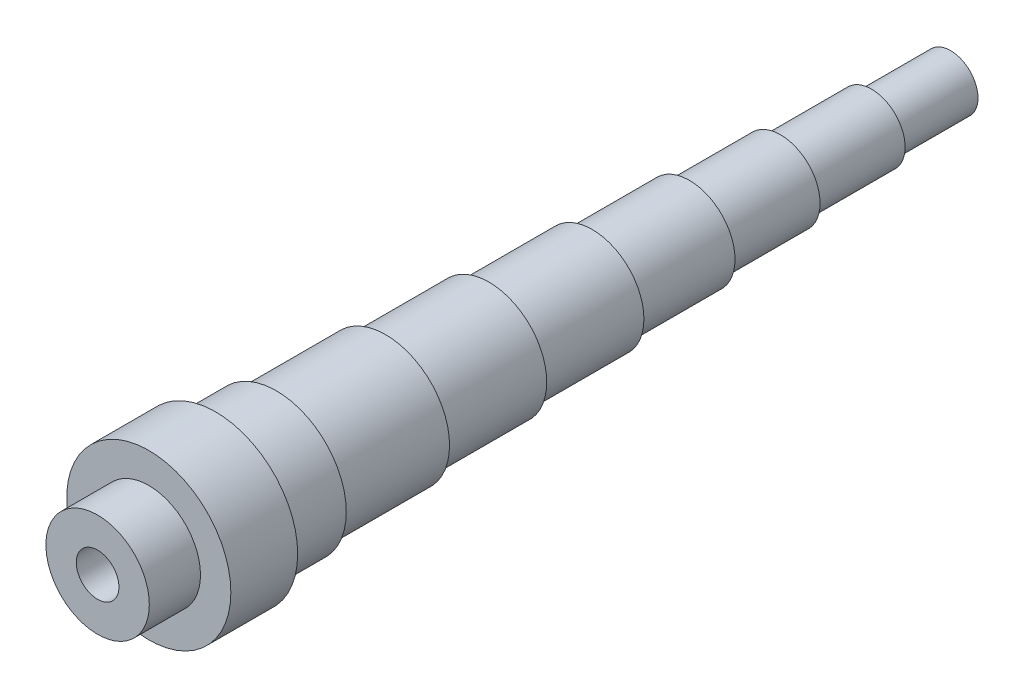
ISO-10303-21;
HEADER;
FILE_DESCRIPTION(('STEP AP214'),'2;1');
FILE_NAME('part.step','',(''),(''),'','','');
FILE_SCHEMA(('AUTOMOTIVE_DESIGN { 1 0 10303 214 1 1 1 1 }'));
ENDSEC;
DATA;
#1=APPLICATION_CONTEXT('core data for automotive mechanical design processes');
#2=APPLICATION_PROTOCOL_DEFINITION('international standard','automotive_design',2000,#1);
#3=PRODUCT_CONTEXT('',#1,'mechanical');
#4=PRODUCT('Part','Part','',(#3));
#5=PRODUCT_RELATED_PRODUCT_CATEGORY('part','',(#4));
#6=PRODUCT_DEFINITION_FORMATION('','',#4);
#7=PRODUCT_DEFINITION_CONTEXT('part definition',#1,'design');
#8=PRODUCT_DEFINITION('design','',#6,#7);
#9=PRODUCT_DEFINITION_SHAPE('','',#8);
#10=(LENGTH_UNIT() NAMED_UNIT(*) SI_UNIT(.MILLI.,.METRE.));
#11=(NAMED_UNIT(*) PLANE_ANGLE_UNIT() SI_UNIT($,.RADIAN.));
#12=(NAMED_UNIT(*) SI_UNIT($,.STERADIAN.) SOLID_ANGLE_UNIT());
#13=UNCERTAINTY_MEASURE_WITH_UNIT(LENGTH_MEASURE(1.E-05),#10,'distance_accuracy_value','');
#14=(GEOMETRIC_REPRESENTATION_CONTEXT(3) GLOBAL_UNCERTAINTY_ASSIGNED_CONTEXT((#13)) GLOBAL_UNIT_ASSIGNED_CONTEXT((#10,
#11,#12)) REPRESENTATION_CONTEXT('',''));
#15=CARTESIAN_POINT('',(0.,0.,0.));
#16=DIRECTION('',(0.,0.,1.));
#17=DIRECTION('',(1.,0.,0.));
#18=AXIS2_PLACEMENT_3D('',#15,#16,#17);
#19=CARTESIAN_POINT('',(0.,0.,19.9049289186182));
#20=DIRECTION('',(0.,0.,1.));
#21=DIRECTION('',(1.,0.,0.));
#22=AXIS2_PLACEMENT_3D('',#19,#20,#21);
#23=CYLINDRICAL_SURFACE('',#22,12.7);
#24=CARTESIAN_POINT('',(0.,0.,-213.40064));
#25=DIRECTION('',(0.,0.,1.));
#26=DIRECTION('',(1.,0.,0.));
#27=AXIS2_PLACEMENT_3D('',#24,#25,#26);
#28=CIRCLE('',#27,12.7);
#29=CARTESIAN_POINT('',(12.7,0.,-213.40064));
#30=VERTEX_POINT('',#29);
#31=EDGE_CURVE('E10',#30,#30,#28,.T.);
#32=ORIENTED_EDGE('',*,*,#31,.F.);
#33=EDGE_LOOP('',(#32));
#34=FACE_BOUND('',#33,.T.);
#35=CARTESIAN_POINT('',(0.,0.,294.51808));
#36=DIRECTION('',(0.,0.,1.));
#37=DIRECTION('',(1.,0.,0.));
#38=AXIS2_PLACEMENT_3D('',#35,#36,#37);
#39=CIRCLE('',#38,12.7);
#40=CARTESIAN_POINT('',(12.7,0.,294.51808));
#41=VERTEX_POINT('',#40);
#42=EDGE_CURVE('E101',#41,#41,#39,.T.);
#43=ORIENTED_EDGE('',*,*,#42,.T.);
#44=EDGE_LOOP('',(#43));
#45=FACE_BOUND('',#44,.T.);
#46=ADVANCED_FACE('F31',(#34,#45),#23,.F.);
#47=CARTESIAN_POINT('',(0.,12.7,-213.40064));
#48=DIRECTION('',(0.,0.,1.));
#49=DIRECTION('',(1.,0.,0.));
#50=AXIS2_PLACEMENT_3D('',#47,#48,#49);
#51=PLANE('',#50);
#52=CARTESIAN_POINT('',(0.,0.,-213.40064));
#53=DIRECTION('',(0.,0.,1.));
#54=DIRECTION('',(1.,0.,0.));
#55=AXIS2_PLACEMENT_3D('',#52,#53,#54);
#56=CIRCLE('',#55,16.31696);
#57=CARTESIAN_POINT('',(16.31696,0.,-213.40064));
#58=VERTEX_POINT('',#57);
#59=EDGE_CURVE('E37',#58,#58,#56,.T.);
#60=ORIENTED_EDGE('',*,*,#59,.F.);
#61=EDGE_LOOP('',(#60));
#62=FACE_BOUND('',#61,.T.);
#63=ORIENTED_EDGE('',*,*,#31,.T.);
#64=EDGE_LOOP('',(#63));
#65=FACE_BOUND('',#64,.T.);
#66=ADVANCED_FACE('F222',(#62,#65),#51,.F.);
#67=CARTESIAN_POINT('',(0.,0.,19.9049289186182));
#68=DIRECTION('',(0.,0.,1.));
#69=DIRECTION('',(1.,0.,0.));
#70=AXIS2_PLACEMENT_3D('',#67,#68,#69);
#71=CYLINDRICAL_SURFACE('',#70,16.31696);
#72=CARTESIAN_POINT('',(0.,0.,-166.38016));
#73=DIRECTION('',(0.,0.,1.));
#74=DIRECTION('',(1.,0.,0.));
#75=AXIS2_PLACEMENT_3D('',#72,#73,#74);
#76=CIRCLE('',#75,16.31696);
#77=CARTESIAN_POINT('',(16.31696,0.,-166.38016));
#78=VERTEX_POINT('',#77);
#79=EDGE_CURVE('E41',#78,#78,#76,.T.);
#80=ORIENTED_EDGE('',*,*,#79,.F.);
#81=EDGE_LOOP('',(#80));
#82=FACE_BOUND('',#81,.T.);
#83=ORIENTED_EDGE('',*,*,#59,.T.);
#84=EDGE_LOOP('',(#83));
#85=FACE_BOUND('',#84,.T.);
#86=ADVANCED_FACE('F217',(#82,#85),#71,.T.);
#87=CARTESIAN_POINT('',(0.,16.31696,-166.38016));
#88=DIRECTION('',(0.,0.,1.));
#89=DIRECTION('',(1.,0.,0.));
#90=AXIS2_PLACEMENT_3D('',#87,#88,#89);
#91=PLANE('',#90);
#92=CARTESIAN_POINT('',(0.,0.,-166.38016));
#93=DIRECTION('',(0.,0.,1.));
#94=DIRECTION('',(1.,0.,0.));
#95=AXIS2_PLACEMENT_3D('',#92,#93,#94);
#96=CIRCLE('',#95,19.93392);
#97=CARTESIAN_POINT('',(19.93392,0.,-166.38016));
#98=VERTEX_POINT('',#97);
#99=EDGE_CURVE('E45',#98,#98,#96,.T.);
#100=ORIENTED_EDGE('',*,*,#99,.F.);
#101=EDGE_LOOP('',(#100));
#102=FACE_BOUND('',#101,.T.);
#103=ORIENTED_EDGE('',*,*,#79,.T.);
#104=EDGE_LOOP('',(#103));
#105=FACE_BOUND('',#104,.T.);
#106=ADVANCED_FACE('F211',(#102,#105),#91,.F.);
#107=CARTESIAN_POINT('',(0.,0.,19.9049289186182));
#108=DIRECTION('',(0.,0.,1.));
#109=DIRECTION('',(1.,0.,0.));
#110=AXIS2_PLACEMENT_3D('',#107,#108,#109);
#111=CYLINDRICAL_SURFACE('',#110,19.93392);
#112=CARTESIAN_POINT('',(0.,0.,-112.12576));
#113=DIRECTION('',(0.,0.,1.));
#114=DIRECTION('',(1.,0.,0.));
#115=AXIS2_PLACEMENT_3D('',#112,#113,#114);
#116=CIRCLE('',#115,19.93392);
#117=CARTESIAN_POINT('',(19.93392,0.,-112.12576));
#118=VERTEX_POINT('',#117);
#119=EDGE_CURVE('E50',#118,#118,#116,.T.);
#120=ORIENTED_EDGE('',*,*,#119,.F.);
#121=EDGE_LOOP('',(#120));
#122=FACE_BOUND('',#121,.T.);
#123=ORIENTED_EDGE('',*,*,#99,.T.);
#124=EDGE_LOOP('',(#123));
#125=FACE_BOUND('',#124,.T.);
#126=ADVANCED_FACE('F205',(#122,#125),#111,.T.);
#127=CARTESIAN_POINT('',(0.,19.93392,-112.12576));
#128=DIRECTION('',(0.,0.,1.));
#129=DIRECTION('',(1.,0.,0.));
#130=AXIS2_PLACEMENT_3D('',#127,#128,#129);
#131=PLANE('',#130);
#132=CARTESIAN_POINT('',(0.,0.,-112.12576));
#133=DIRECTION('',(0.,0.,1.));
#134=DIRECTION('',(1.,0.,0.));
#135=AXIS2_PLACEMENT_3D('',#132,#133,#134);
#136=CIRCLE('',#135,23.55088);
#137=CARTESIAN_POINT('',(23.55088,0.,-112.12576));
#138=VERTEX_POINT('',#137);
#139=EDGE_CURVE('E53',#138,#138,#136,.T.);
#140=ORIENTED_EDGE('',*,*,#139,.F.);
#141=EDGE_LOOP('',(#140));
#142=FACE_BOUND('',#141,.T.);
#143=ORIENTED_EDGE('',*,*,#119,.T.);
#144=EDGE_LOOP('',(#143));
#145=FACE_BOUND('',#144,.T.);
#146=ADVANCED_FACE('F199',(#142,#145),#131,.F.);
#147=CARTESIAN_POINT('',(0.,0.,19.9049289186182));
#148=DIRECTION('',(0.,0.,1.));
#149=DIRECTION('',(1.,0.,0.));
#150=AXIS2_PLACEMENT_3D('',#147,#148,#149);
#151=CYLINDRICAL_SURFACE('',#150,23.55088);
#152=CARTESIAN_POINT('',(0.,0.,-57.87136));
#153=DIRECTION('',(0.,0.,1.));
#154=DIRECTION('',(1.,0.,0.));
#155=AXIS2_PLACEMENT_3D('',#152,#153,#154);
#156=CIRCLE('',#155,23.55088);
#157=CARTESIAN_POINT('',(23.55088,0.,-57.87136));
#158=VERTEX_POINT('',#157);
#159=EDGE_CURVE('E56',#158,#158,#156,.T.);
#160=ORIENTED_EDGE('',*,*,#159,.F.);
#161=EDGE_LOOP('',(#160));
#162=FACE_BOUND('',#161,.T.);
#163=ORIENTED_EDGE('',*,*,#139,.T.);
#164=EDGE_LOOP('',(#163));
#165=FACE_BOUND('',#164,.T.);
#166=ADVANCED_FACE('F193',(#162,#165),#151,.T.);
#167=CARTESIAN_POINT('',(0.,23.55088,-57.87136));
#168=DIRECTION('',(0.,0.,1.));
#169=DIRECTION('',(1.,0.,0.));
#170=AXIS2_PLACEMENT_3D('',#167,#168,#169);
#171=PLANE('',#170);
#172=CARTESIAN_POINT('',(0.,0.,-57.87136));
#173=DIRECTION('',(0.,0.,1.));
#174=DIRECTION('',(1.,0.,0.));
#175=AXIS2_PLACEMENT_3D('',#172,#173,#174);
#176=CIRCLE('',#175,27.16784);
#177=CARTESIAN_POINT('',(27.16784,0.,-57.87136));
#178=VERTEX_POINT('',#177);
#179=EDGE_CURVE('E59',#178,#178,#176,.T.);
#180=ORIENTED_EDGE('',*,*,#179,.F.);
#181=EDGE_LOOP('',(#180));
#182=FACE_BOUND('',#181,.T.);
#183=ORIENTED_EDGE('',*,*,#159,.T.);
#184=EDGE_LOOP('',(#183));
#185=FACE_BOUND('',#184,.T.);
#186=ADVANCED_FACE('F187',(#182,#185),#171,.F.);
#187=CARTESIAN_POINT('',(0.,0.,19.9049289186182));
#188=DIRECTION('',(0.,0.,1.));
#189=DIRECTION('',(1.,0.,0.));
#190=AXIS2_PLACEMENT_3D('',#187,#188,#189);
#191=CYLINDRICAL_SURFACE('',#190,27.16784);
#192=CARTESIAN_POINT('',(0.,0.,0.));
#193=DIRECTION('',(0.,0.,1.));
#194=DIRECTION('',(1.,0.,0.));
#195=AXIS2_PLACEMENT_3D('',#192,#193,#194);
#196=CIRCLE('',#195,27.16784);
#197=CARTESIAN_POINT('',(27.16784,0.,0.));
#198=VERTEX_POINT('',#197);
#199=EDGE_CURVE('E62',#198,#198,#196,.T.);
#200=ORIENTED_EDGE('',*,*,#199,.F.);
#201=EDGE_LOOP('',(#200));
#202=FACE_BOUND('',#201,.T.);
#203=ORIENTED_EDGE('',*,*,#179,.T.);
#204=EDGE_LOOP('',(#203));
#205=FACE_BOUND('',#204,.T.);
#206=ADVANCED_FACE('F181',(#202,#205),#191,.T.);
#207=CARTESIAN_POINT('',(0.,27.16784,0.));
#208=DIRECTION('',(0.,0.,1.));
#209=DIRECTION('',(1.,0.,0.));
#210=AXIS2_PLACEMENT_3D('',#207,#208,#209);
#211=PLANE('',#210);
#212=CARTESIAN_POINT('',(0.,0.,0.));
#213=DIRECTION('',(0.,0.,1.));
#214=DIRECTION('',(1.,0.,0.));
#215=AXIS2_PLACEMENT_3D('',#212,#213,#214);
#216=CIRCLE('',#215,30.7848);
#217=CARTESIAN_POINT('',(30.7848,0.,0.));
#218=VERTEX_POINT('',#217);
#219=EDGE_CURVE('E65',#218,#218,#216,.T.);
#220=ORIENTED_EDGE('',*,*,#219,.F.);
#221=EDGE_LOOP('',(#220));
#222=FACE_BOUND('',#221,.T.);
#223=ORIENTED_EDGE('',*,*,#199,.T.);
#224=EDGE_LOOP('',(#223));
#225=FACE_BOUND('',#224,.T.);
#226=ADVANCED_FACE('F175',(#222,#225),#211,.F.);
#227=CARTESIAN_POINT('',(0.,0.,19.9049289186182));
#228=DIRECTION('',(0.,0.,1.));
#229=DIRECTION('',(1.,0.,0.));
#230=AXIS2_PLACEMENT_3D('',#227,#228,#229);
#231=CYLINDRICAL_SURFACE('',#230,30.7848);
#232=CARTESIAN_POINT('',(0.,0.,61.48832));
#233=DIRECTION('',(0.,0.,1.));
#234=DIRECTION('',(1.,0.,0.));
#235=AXIS2_PLACEMENT_3D('',#232,#233,#234);
#236=CIRCLE('',#235,30.7848);
#237=CARTESIAN_POINT('',(30.7848,0.,61.48832));
#238=VERTEX_POINT('',#237);
#239=EDGE_CURVE('E68',#238,#238,#236,.T.);
#240=ORIENTED_EDGE('',*,*,#239,.F.);
#241=EDGE_LOOP('',(#240));
#242=FACE_BOUND('',#241,.T.);
#243=ORIENTED_EDGE('',*,*,#219,.T.);
#244=EDGE_LOOP('',(#243));
#245=FACE_BOUND('',#244,.T.);
#246=ADVANCED_FACE('F169',(#242,#245),#231,.T.);
#247=CARTESIAN_POINT('',(0.,30.7848,61.48832));
#248=DIRECTION('',(0.,0.,1.));
#249=DIRECTION('',(1.,0.,0.));
#250=AXIS2_PLACEMENT_3D('',#247,#248,#249);
#251=PLANE('',#250);
#252=CARTESIAN_POINT('',(0.,0.,61.48832));
#253=DIRECTION('',(0.,0.,1.));
#254=DIRECTION('',(1.,0.,0.));
#255=AXIS2_PLACEMENT_3D('',#252,#253,#254);
#256=CIRCLE('',#255,34.40176);
#257=CARTESIAN_POINT('',(34.40176,0.,61.48832));
#258=VERTEX_POINT('',#257);
#259=EDGE_CURVE('E71',#258,#258,#256,.T.);
#260=ORIENTED_EDGE('',*,*,#259,.F.);
#261=EDGE_LOOP('',(#260));
#262=FACE_BOUND('',#261,.T.);
#263=ORIENTED_EDGE('',*,*,#239,.T.);
#264=EDGE_LOOP('',(#263));
#265=FACE_BOUND('',#264,.T.);
#266=ADVANCED_FACE('F163',(#262,#265),#251,.F.);
#267=CARTESIAN_POINT('',(0.,0.,19.9049289186182));
#268=DIRECTION('',(0.,0.,1.));
#269=DIRECTION('',(1.,0.,0.));
#270=AXIS2_PLACEMENT_3D('',#267,#268,#269);
#271=CYLINDRICAL_SURFACE('',#270,34.40176);
#272=CARTESIAN_POINT('',(0.,0.,122.97664));
#273=DIRECTION('',(0.,0.,1.));
#274=DIRECTION('',(1.,0.,0.));
#275=AXIS2_PLACEMENT_3D('',#272,#273,#274);
#276=CIRCLE('',#275,34.40176);
#277=CARTESIAN_POINT('',(34.40176,0.,122.97664));
#278=VERTEX_POINT('',#277);
#279=EDGE_CURVE('E74',#278,#278,#276,.T.);
#280=ORIENTED_EDGE('',*,*,#279,.F.);
#281=EDGE_LOOP('',(#280));
#282=FACE_BOUND('',#281,.T.);
#283=ORIENTED_EDGE('',*,*,#259,.T.);
#284=EDGE_LOOP('',(#283));
#285=FACE_BOUND('',#284,.T.);
#286=ADVANCED_FACE('F157',(#282,#285),#271,.T.);
#287=CARTESIAN_POINT('',(0.,34.40176,122.97664));
#288=DIRECTION('',(0.,0.,1.));
#289=DIRECTION('',(1.,0.,0.));
#290=AXIS2_PLACEMENT_3D('',#287,#288,#289);
#291=PLANE('',#290);
#292=CARTESIAN_POINT('',(0.,0.,122.97664));
#293=DIRECTION('',(0.,0.,1.));
#294=DIRECTION('',(1.,0.,0.));
#295=AXIS2_PLACEMENT_3D('',#292,#293,#294);
#296=CIRCLE('',#295,38.01872);
#297=CARTESIAN_POINT('',(38.01872,0.,122.97664));
#298=VERTEX_POINT('',#297);
#299=EDGE_CURVE('E77',#298,#298,#296,.T.);
#300=ORIENTED_EDGE('',*,*,#299,.F.);
#301=EDGE_LOOP('',(#300));
#302=FACE_BOUND('',#301,.T.);
#303=ORIENTED_EDGE('',*,*,#279,.T.);
#304=EDGE_LOOP('',(#303));
#305=FACE_BOUND('',#304,.T.);
#306=ADVANCED_FACE('F151',(#302,#305),#291,.F.);
#307=CARTESIAN_POINT('',(0.,0.,19.9049289186182));
#308=DIRECTION('',(0.,0.,1.));
#309=DIRECTION('',(1.,0.,0.));
#310=AXIS2_PLACEMENT_3D('',#307,#308,#309);
#311=CYLINDRICAL_SURFACE('',#310,38.01872);
#312=CARTESIAN_POINT('',(0.,0.,188.08192));
#313=DIRECTION('',(0.,0.,1.));
#314=DIRECTION('',(1.,0.,0.));
#315=AXIS2_PLACEMENT_3D('',#312,#313,#314);
#316=CIRCLE('',#315,38.01872);
#317=CARTESIAN_POINT('',(38.01872,0.,188.08192));
#318=VERTEX_POINT('',#317);
#319=EDGE_CURVE('E80',#318,#318,#316,.T.);
#320=ORIENTED_EDGE('',*,*,#319,.F.);
#321=EDGE_LOOP('',(#320));
#322=FACE_BOUND('',#321,.T.);
#323=ORIENTED_EDGE('',*,*,#299,.T.);
#324=EDGE_LOOP('',(#323));
#325=FACE_BOUND('',#324,.T.);
#326=ADVANCED_FACE('F145',(#322,#325),#311,.T.);
#327=CARTESIAN_POINT('',(0.,38.01872,188.08192));
#328=DIRECTION('',(0.,0.,1.));
#329=DIRECTION('',(1.,0.,0.));
#330=AXIS2_PLACEMENT_3D('',#327,#328,#329);
#331=PLANE('',#330);
#332=CARTESIAN_POINT('',(0.,0.,188.08192));
#333=DIRECTION('',(0.,0.,1.));
#334=DIRECTION('',(1.,0.,0.));
#335=AXIS2_PLACEMENT_3D('',#332,#333,#334);
#336=CIRCLE('',#335,41.63568);
#337=CARTESIAN_POINT('',(41.63568,0.,188.08192));
#338=VERTEX_POINT('',#337);
#339=EDGE_CURVE('E83',#338,#338,#336,.T.);
#340=ORIENTED_EDGE('',*,*,#339,.F.);
#341=EDGE_LOOP('',(#340));
#342=FACE_BOUND('',#341,.T.);
#343=ORIENTED_EDGE('',*,*,#319,.T.);
#344=EDGE_LOOP('',(#343));
#345=FACE_BOUND('',#344,.T.);
#346=ADVANCED_FACE('F139',(#342,#345),#331,.F.);
#347=CARTESIAN_POINT('',(0.,0.,19.9049289186182));
#348=DIRECTION('',(0.,0.,1.));
#349=DIRECTION('',(1.,0.,0.));
#350=AXIS2_PLACEMENT_3D('',#347,#348,#349);
#351=CYLINDRICAL_SURFACE('',#350,41.63568);
#352=CARTESIAN_POINT('',(0.,0.,224.25152));
#353=DIRECTION('',(0.,0.,1.));
#354=DIRECTION('',(1.,0.,0.));
#355=AXIS2_PLACEMENT_3D('',#352,#353,#354);
#356=CIRCLE('',#355,41.6356799999999);
#357=CARTESIAN_POINT('',(41.6356799999999,0.,224.25152));
#358=VERTEX_POINT('',#357);
#359=EDGE_CURVE('E86',#358,#358,#356,.T.);
#360=ORIENTED_EDGE('',*,*,#359,.F.);
#361=EDGE_LOOP('',(#360));
#362=FACE_BOUND('',#361,.T.);
#363=ORIENTED_EDGE('',*,*,#339,.T.);
#364=EDGE_LOOP('',(#363));
#365=FACE_BOUND('',#364,.T.);
#366=ADVANCED_FACE('F133',(#362,#365),#351,.T.);
#367=CARTESIAN_POINT('',(0.,41.6356799999999,224.25152));
#368=DIRECTION('',(0.,0.,1.));
#369=DIRECTION('',(1.,0.,0.));
#370=AXIS2_PLACEMENT_3D('',#367,#368,#369);
#371=PLANE('',#370);
#372=CARTESIAN_POINT('',(0.,0.,224.25152));
#373=DIRECTION('',(0.,0.,1.));
#374=DIRECTION('',(1.,0.,0.));
#375=AXIS2_PLACEMENT_3D('',#372,#373,#374);
#376=CIRCLE('',#375,48.8695999999999);
#377=CARTESIAN_POINT('',(48.8695999999999,0.,224.25152));
#378=VERTEX_POINT('',#377);
#379=EDGE_CURVE('E89',#378,#378,#376,.T.);
#380=ORIENTED_EDGE('',*,*,#379,.F.);
#381=EDGE_LOOP('',(#380));
#382=FACE_BOUND('',#381,.T.);
#383=ORIENTED_EDGE('',*,*,#359,.T.);
#384=EDGE_LOOP('',(#383));
#385=FACE_BOUND('',#384,.T.);
#386=ADVANCED_FACE('F127',(#382,#385),#371,.F.);
#387=CARTESIAN_POINT('',(0.,0.,19.9049289186182));
#388=DIRECTION('',(0.,0.,1.));
#389=DIRECTION('',(1.,0.,0.));
#390=AXIS2_PLACEMENT_3D('',#387,#388,#389);
#391=CYLINDRICAL_SURFACE('',#390,48.8695999999999);
#392=CARTESIAN_POINT('',(0.,0.,264.03808));
#393=DIRECTION('',(0.,0.,1.));
#394=DIRECTION('',(1.,0.,0.));
#395=AXIS2_PLACEMENT_3D('',#392,#393,#394);
#396=CIRCLE('',#395,48.8695999999999);
#397=CARTESIAN_POINT('',(48.8695999999999,0.,264.03808));
#398=VERTEX_POINT('',#397);
#399=EDGE_CURVE('E92',#398,#398,#396,.T.);
#400=ORIENTED_EDGE('',*,*,#399,.F.);
#401=EDGE_LOOP('',(#400));
#402=FACE_BOUND('',#401,.T.);
#403=ORIENTED_EDGE('',*,*,#379,.T.);
#404=EDGE_LOOP('',(#403));
#405=FACE_BOUND('',#404,.T.);
#406=ADVANCED_FACE('F121',(#402,#405),#391,.T.);
#407=CARTESIAN_POINT('',(0.,38.01872,264.03808));
#408=DIRECTION('',(0.,0.,-1.));
#409=DIRECTION('',(-1.,0.,0.));
#410=AXIS2_PLACEMENT_3D('',#407,#408,#409);
#411=PLANE('',#410);
#412=CARTESIAN_POINT('',(0.,0.,264.03808));
#413=DIRECTION('',(0.,0.,1.));
#414=DIRECTION('',(1.,0.,0.));
#415=AXIS2_PLACEMENT_3D('',#412,#413,#414);
#416=CIRCLE('',#415,30.7848);
#417=CARTESIAN_POINT('',(30.7848,0.,264.03808));
#418=VERTEX_POINT('',#417);
#419=EDGE_CURVE('E95',#418,#418,#416,.T.);
#420=ORIENTED_EDGE('',*,*,#419,.F.);
#421=EDGE_LOOP('',(#420));
#422=FACE_BOUND('',#421,.T.);
#423=ORIENTED_EDGE('',*,*,#399,.T.);
#424=EDGE_LOOP('',(#423));
#425=FACE_BOUND('',#424,.T.);
#426=ADVANCED_FACE('F115',(#422,#425),#411,.F.);
#427=CARTESIAN_POINT('',(0.,0.,19.9049289186182));
#428=DIRECTION('',(0.,0.,1.));
#429=DIRECTION('',(1.,0.,0.));
#430=AXIS2_PLACEMENT_3D('',#427,#428,#429);
#431=CYLINDRICAL_SURFACE('',#430,30.7847999999999);
#432=CARTESIAN_POINT('',(0.,0.,294.51808));
#433=DIRECTION('',(0.,0.,1.));
#434=DIRECTION('',(1.,0.,0.));
#435=AXIS2_PLACEMENT_3D('',#432,#433,#434);
#436=CIRCLE('',#435,30.7847999999999);
#437=CARTESIAN_POINT('',(30.7847999999999,0.,294.51808));
#438=VERTEX_POINT('',#437);
#439=EDGE_CURVE('E98',#438,#438,#436,.T.);
#440=ORIENTED_EDGE('',*,*,#439,.F.);
#441=EDGE_LOOP('',(#440));
#442=FACE_BOUND('',#441,.T.);
#443=ORIENTED_EDGE('',*,*,#419,.T.);
#444=EDGE_LOOP('',(#443));
#445=FACE_BOUND('',#444,.T.);
#446=ADVANCED_FACE('F109',(#442,#445),#431,.T.);
#447=CARTESIAN_POINT('',(0.,30.7847999999999,294.51808));
#448=DIRECTION('',(0.,0.,-1.));
#449=DIRECTION('',(-1.,0.,0.));
#450=AXIS2_PLACEMENT_3D('',#447,#448,#449);
#451=PLANE('',#450);
#452=ORIENTED_EDGE('',*,*,#42,.F.);
#453=EDGE_LOOP('',(#452));
#454=FACE_BOUND('',#453,.T.);
#455=ORIENTED_EDGE('',*,*,#439,.T.);
#456=EDGE_LOOP('',(#455));
#457=FACE_BOUND('',#456,.T.);
#458=ADVANCED_FACE('F106',(#454,#457),#451,.F.);
#459=CLOSED_SHELL('',(#46,#66,#86,#106,#126,#146,#166,#186,#206,#226,#246,#266,#286,#306,#326,
#346,#366,#386,#406,#426,#446,#458));
#460=MANIFOLD_SOLID_BREP('B2',#459);
#461=ADVANCED_BREP_SHAPE_REPRESENTATION('',(#18,#460),#14);
#462=SHAPE_DEFINITION_REPRESENTATION(#9,#461);
ENDSEC;
END-ISO-10303-21;
